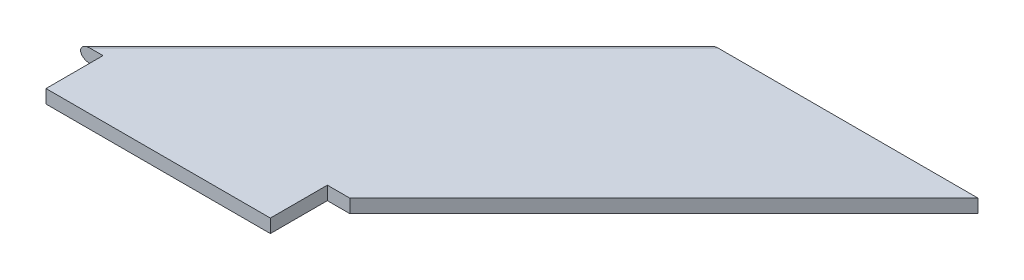
ISO-10303-21;
HEADER;
FILE_DESCRIPTION(('STEP AP214'),'2;1');
FILE_NAME('part.step','',(''),(''),'','','');
FILE_SCHEMA(('AUTOMOTIVE_DESIGN { 1 0 10303 214 1 1 1 1 }'));
ENDSEC;
DATA;
#1=APPLICATION_CONTEXT('core data for automotive mechanical design processes');
#2=APPLICATION_PROTOCOL_DEFINITION('international standard','automotive_design',2000,#1);
#3=PRODUCT_CONTEXT('',#1,'mechanical');
#4=PRODUCT('Part','Part','',(#3));
#5=PRODUCT_RELATED_PRODUCT_CATEGORY('part','',(#4));
#6=PRODUCT_DEFINITION_FORMATION('','',#4);
#7=PRODUCT_DEFINITION_CONTEXT('part definition',#1,'design');
#8=PRODUCT_DEFINITION('design','',#6,#7);
#9=PRODUCT_DEFINITION_SHAPE('','',#8);
#10=(LENGTH_UNIT() NAMED_UNIT(*) SI_UNIT(.MILLI.,.METRE.));
#11=(NAMED_UNIT(*) PLANE_ANGLE_UNIT() SI_UNIT($,.RADIAN.));
#12=(NAMED_UNIT(*) SI_UNIT($,.STERADIAN.) SOLID_ANGLE_UNIT());
#13=UNCERTAINTY_MEASURE_WITH_UNIT(LENGTH_MEASURE(1.E-05),#10,'distance_accuracy_value','');
#14=(GEOMETRIC_REPRESENTATION_CONTEXT(3) GLOBAL_UNCERTAINTY_ASSIGNED_CONTEXT((#13)) GLOBAL_UNIT_ASSIGNED_CONTEXT((#10,
#11,#12)) REPRESENTATION_CONTEXT('',''));
#15=CARTESIAN_POINT('',(0.,0.,0.));
#16=DIRECTION('',(0.,0.,1.));
#17=DIRECTION('',(1.,0.,0.));
#18=AXIS2_PLACEMENT_3D('',#15,#16,#17);
#19=CARTESIAN_POINT('',(4.99999999999999,3.,0.));
#20=DIRECTION('',(0.,0.,-1.));
#21=DIRECTION('',(-1.,0.,0.));
#22=AXIS2_PLACEMENT_3D('',#19,#20,#21);
#23=PLANE('',#22);
#24=DIRECTION('',(1.,0.,0.));
#25=VECTOR('',#24,1.);
#26=CARTESIAN_POINT('',(4.99999999999999,3.,0.));
#27=LINE('',#26,#25);
#28=CARTESIAN_POINT('',(2.12132034355964,3.,0.));
#29=VERTEX_POINT('',#28);
#30=CARTESIAN_POINT('',(4.99999999999999,3.,0.));
#31=VERTEX_POINT('',#30);
#32=EDGE_CURVE('E112',#29,#31,#27,.T.);
#33=ORIENTED_EDGE('',*,*,#32,.F.);
#34=CARTESIAN_POINT('',(2.12132034355964,1.5,0.));
#35=DIRECTION('',(0.,0.,-1.));
#36=DIRECTION('',(1.,0.,0.));
#37=AXIS2_PLACEMENT_3D('',#34,#35,#36);
#38=ELLIPSE('',#37,2.12132034355964,1.5);
#39=CARTESIAN_POINT('',(0.,1.5,0.));
#40=VERTEX_POINT('',#39);
#41=EDGE_CURVE('E149',#29,#40,#38,.F.);
#42=ORIENTED_EDGE('',*,*,#41,.T.);
#43=CARTESIAN_POINT('',(2.12132034355964,1.5,0.));
#44=DIRECTION('',(0.,0.,-1.));
#45=DIRECTION('',(-1.,0.,0.));
#46=AXIS2_PLACEMENT_3D('',#43,#44,#45);
#47=ELLIPSE('',#46,2.12132034355964,1.5);
#48=CARTESIAN_POINT('',(2.12132034355963,0.,0.));
#49=VERTEX_POINT('',#48);
#50=EDGE_CURVE('E141',#40,#49,#47,.F.);
#51=ORIENTED_EDGE('',*,*,#50,.T.);
#52=DIRECTION('',(1.,0.,0.));
#53=VECTOR('',#52,1.);
#54=CARTESIAN_POINT('',(4.99999999999999,0.,0.));
#55=LINE('',#54,#53);
#56=CARTESIAN_POINT('',(4.99999999999999,0.,0.));
#57=VERTEX_POINT('',#56);
#58=EDGE_CURVE('E135',#49,#57,#55,.T.);
#59=ORIENTED_EDGE('',*,*,#58,.T.);
#60=DIRECTION('',(0.,-1.,0.));
#61=VECTOR('',#60,1.);
#62=CARTESIAN_POINT('',(4.99999999999999,3.,0.));
#63=LINE('',#62,#61);
#64=EDGE_CURVE('E128',#31,#57,#63,.T.);
#65=ORIENTED_EDGE('',*,*,#64,.F.);
#66=EDGE_LOOP('',(#33,#42,#51,#59,#65));
#67=FACE_BOUND('',#66,.T.);
#68=ADVANCED_FACE('F39',(#67),#23,.F.);
#69=CARTESIAN_POINT('',(5.,3.,12.7));
#70=DIRECTION('',(1.,0.,0.));
#71=DIRECTION('',(0.,0.,-1.));
#72=AXIS2_PLACEMENT_3D('',#69,#70,#71);
#73=PLANE('',#72);
#74=DIRECTION('',(0.,0.,1.));
#75=VECTOR('',#74,1.);
#76=CARTESIAN_POINT('',(5.,0.,12.7));
#77=LINE('',#76,#75);
#78=CARTESIAN_POINT('',(5.,0.,12.7));
#79=VERTEX_POINT('',#78);
#80=EDGE_CURVE('E173',#57,#79,#77,.T.);
#81=ORIENTED_EDGE('',*,*,#80,.T.);
#82=DIRECTION('',(0.,-1.,0.));
#83=VECTOR('',#82,1.);
#84=CARTESIAN_POINT('',(5.,3.,12.7));
#85=LINE('',#84,#83);
#86=CARTESIAN_POINT('',(5.,3.,12.7));
#87=VERTEX_POINT('',#86);
#88=EDGE_CURVE('E130',#87,#79,#85,.T.);
#89=ORIENTED_EDGE('',*,*,#88,.F.);
#90=DIRECTION('',(0.,0.,1.));
#91=VECTOR('',#90,1.);
#92=CARTESIAN_POINT('',(5.,3.,12.7));
#93=LINE('',#92,#91);
#94=EDGE_CURVE('E116',#31,#87,#93,.T.);
#95=ORIENTED_EDGE('',*,*,#94,.F.);
#96=ORIENTED_EDGE('',*,*,#64,.T.);
#97=EDGE_LOOP('',(#81,#89,#95,#96));
#98=FACE_BOUND('',#97,.T.);
#99=ADVANCED_FACE('F127',(#98),#73,.F.);
#100=CARTESIAN_POINT('',(55.,3.,12.7));
#101=DIRECTION('',(0.,0.,-1.));
#102=DIRECTION('',(-1.,0.,0.));
#103=AXIS2_PLACEMENT_3D('',#100,#101,#102);
#104=PLANE('',#103);
#105=DIRECTION('',(1.,0.,0.));
#106=VECTOR('',#105,1.);
#107=CARTESIAN_POINT('',(55.,0.,12.7));
#108=LINE('',#107,#106);
#109=CARTESIAN_POINT('',(55.,0.,12.7));
#110=VERTEX_POINT('',#109);
#111=EDGE_CURVE('E176',#79,#110,#108,.T.);
#112=ORIENTED_EDGE('',*,*,#111,.T.);
#113=DIRECTION('',(0.,-1.,0.));
#114=VECTOR('',#113,1.);
#115=CARTESIAN_POINT('',(55.,3.,12.7));
#116=LINE('',#115,#114);
#117=CARTESIAN_POINT('',(55.,3.,12.7));
#118=VERTEX_POINT('',#117);
#119=EDGE_CURVE('E143',#118,#110,#116,.T.);
#120=ORIENTED_EDGE('',*,*,#119,.F.);
#121=DIRECTION('',(1.,0.,0.));
#122=VECTOR('',#121,1.);
#123=CARTESIAN_POINT('',(55.,3.,12.7));
#124=LINE('',#123,#122);
#125=EDGE_CURVE('E133',#87,#118,#124,.T.);
#126=ORIENTED_EDGE('',*,*,#125,.F.);
#127=ORIENTED_EDGE('',*,*,#88,.T.);
#128=EDGE_LOOP('',(#112,#120,#126,#127));
#129=FACE_BOUND('',#128,.T.);
#130=ADVANCED_FACE('F230',(#129),#104,.F.);
#131=CARTESIAN_POINT('',(55.,3.,0.));
#132=DIRECTION('',(-1.,0.,0.));
#133=DIRECTION('',(0.,0.,1.));
#134=AXIS2_PLACEMENT_3D('',#131,#132,#133);
#135=PLANE('',#134);
#136=DIRECTION('',(0.,0.,-1.));
#137=VECTOR('',#136,1.);
#138=CARTESIAN_POINT('',(55.,0.,0.));
#139=LINE('',#138,#137);
#140=CARTESIAN_POINT('',(55.,0.,0.));
#141=VERTEX_POINT('',#140);
#142=EDGE_CURVE('E182',#110,#141,#139,.T.);
#143=ORIENTED_EDGE('',*,*,#142,.T.);
#144=DIRECTION('',(0.,-1.,0.));
#145=VECTOR('',#144,1.);
#146=CARTESIAN_POINT('',(55.,3.,0.));
#147=LINE('',#146,#145);
#148=CARTESIAN_POINT('',(55.,3.,0.));
#149=VERTEX_POINT('',#148);
#150=EDGE_CURVE('E199',#149,#141,#147,.T.);
#151=ORIENTED_EDGE('',*,*,#150,.F.);
#152=DIRECTION('',(0.,0.,-1.));
#153=VECTOR('',#152,1.);
#154=CARTESIAN_POINT('',(55.,3.,0.));
#155=LINE('',#154,#153);
#156=EDGE_CURVE('E210',#118,#149,#155,.T.);
#157=ORIENTED_EDGE('',*,*,#156,.F.);
#158=ORIENTED_EDGE('',*,*,#119,.T.);
#159=EDGE_LOOP('',(#143,#151,#157,#158));
#160=FACE_BOUND('',#159,.T.);
#161=ADVANCED_FACE('F208',(#160),#135,.F.);
#162=CARTESIAN_POINT('',(60.,3.,0.));
#163=DIRECTION('',(0.,0.,-1.));
#164=DIRECTION('',(-1.,0.,0.));
#165=AXIS2_PLACEMENT_3D('',#162,#163,#164);
#166=PLANE('',#165);
#167=DIRECTION('',(1.,0.,0.));
#168=VECTOR('',#167,1.);
#169=CARTESIAN_POINT('',(60.,0.,0.));
#170=LINE('',#169,#168);
#171=CARTESIAN_POINT('',(60.,0.,0.));
#172=VERTEX_POINT('',#171);
#173=EDGE_CURVE('E185',#141,#172,#170,.T.);
#174=ORIENTED_EDGE('',*,*,#173,.T.);
#175=DIRECTION('',(0.,-1.,0.));
#176=VECTOR('',#175,1.);
#177=CARTESIAN_POINT('',(60.,3.,0.));
#178=LINE('',#177,#176);
#179=CARTESIAN_POINT('',(60.,3.,0.));
#180=VERTEX_POINT('',#179);
#181=EDGE_CURVE('E195',#180,#172,#178,.T.);
#182=ORIENTED_EDGE('',*,*,#181,.F.);
#183=DIRECTION('',(1.,0.,0.));
#184=VECTOR('',#183,1.);
#185=CARTESIAN_POINT('',(60.,3.,0.));
#186=LINE('',#185,#184);
#187=EDGE_CURVE('E223',#149,#180,#186,.T.);
#188=ORIENTED_EDGE('',*,*,#187,.F.);
#189=ORIENTED_EDGE('',*,*,#150,.T.);
#190=EDGE_LOOP('',(#174,#182,#188,#189));
#191=FACE_BOUND('',#190,.T.);
#192=ADVANCED_FACE('F218',(#191),#166,.F.);
#193=CARTESIAN_POINT('',(130.,3.,-70.));
#194=DIRECTION('',(-0.707106781186548,0.,-0.707106781186547));
#195=DIRECTION('',(-0.707106781186547,0.,0.707106781186548));
#196=AXIS2_PLACEMENT_3D('',#193,#194,#195);
#197=PLANE('',#196);
#198=DIRECTION('',(0.707106781186547,0.,-0.707106781186548));
#199=VECTOR('',#198,1.);
#200=CARTESIAN_POINT('',(130.,0.,-70.));
#201=LINE('',#200,#199);
#202=CARTESIAN_POINT('',(130.,0.,-70.));
#203=VERTEX_POINT('',#202);
#204=EDGE_CURVE('E188',#172,#203,#201,.T.);
#205=ORIENTED_EDGE('',*,*,#204,.T.);
#206=DIRECTION('',(0.,-1.,0.));
#207=VECTOR('',#206,1.);
#208=CARTESIAN_POINT('',(130.,3.,-70.));
#209=LINE('',#208,#207);
#210=CARTESIAN_POINT('',(130.,3.,-70.));
#211=VERTEX_POINT('',#210);
#212=EDGE_CURVE('E166',#211,#203,#209,.T.);
#213=ORIENTED_EDGE('',*,*,#212,.F.);
#214=DIRECTION('',(0.707106781186547,0.,-0.707106781186548));
#215=VECTOR('',#214,1.);
#216=CARTESIAN_POINT('',(130.,3.,-70.));
#217=LINE('',#216,#215);
#218=EDGE_CURVE('E163',#180,#211,#217,.T.);
#219=ORIENTED_EDGE('',*,*,#218,.F.);
#220=ORIENTED_EDGE('',*,*,#181,.T.);
#221=EDGE_LOOP('',(#205,#213,#219,#220));
#222=FACE_BOUND('',#221,.T.);
#223=ADVANCED_FACE('F221',(#222),#197,.F.);
#224=CARTESIAN_POINT('',(70.,3.,-70.));
#225=DIRECTION('',(0.,0.,1.));
#226=DIRECTION('',(1.,0.,0.));
#227=AXIS2_PLACEMENT_3D('',#224,#225,#226);
#228=PLANE('',#227);
#229=CARTESIAN_POINT('',(72.1213203435596,1.5,-70.));
#230=DIRECTION('',(0.,0.,1.));
#231=DIRECTION('',(-1.,0.,0.));
#232=AXIS2_PLACEMENT_3D('',#229,#230,#231);
#233=ELLIPSE('',#232,2.12132034355964,1.5);
#234=CARTESIAN_POINT('',(72.1213203435596,0.,-70.));
#235=VERTEX_POINT('',#234);
#236=CARTESIAN_POINT('',(70.,1.5,-70.));
#237=VERTEX_POINT('',#236);
#238=EDGE_CURVE('E56',#235,#237,#233,.F.);
#239=ORIENTED_EDGE('',*,*,#238,.T.);
#240=CARTESIAN_POINT('',(72.1213203435596,1.5,-70.));
#241=DIRECTION('',(0.,0.,1.));
#242=DIRECTION('',(1.,0.,0.));
#243=AXIS2_PLACEMENT_3D('',#240,#241,#242);
#244=ELLIPSE('',#243,2.12132034355964,1.5);
#245=CARTESIAN_POINT('',(72.1213203435596,3.,-70.));
#246=VERTEX_POINT('',#245);
#247=EDGE_CURVE('E49',#237,#246,#244,.F.);
#248=ORIENTED_EDGE('',*,*,#247,.T.);
#249=DIRECTION('',(-1.,0.,0.));
#250=VECTOR('',#249,1.);
#251=CARTESIAN_POINT('',(70.,3.,-70.));
#252=LINE('',#251,#250);
#253=EDGE_CURVE('E159',#211,#246,#252,.T.);
#254=ORIENTED_EDGE('',*,*,#253,.F.);
#255=ORIENTED_EDGE('',*,*,#212,.T.);
#256=DIRECTION('',(-1.,0.,0.));
#257=VECTOR('',#256,1.);
#258=CARTESIAN_POINT('',(70.,0.,-70.));
#259=LINE('',#258,#257);
#260=EDGE_CURVE('E123',#203,#235,#259,.T.);
#261=ORIENTED_EDGE('',*,*,#260,.T.);
#262=EDGE_LOOP('',(#239,#248,#254,#255,#261));
#263=FACE_BOUND('',#262,.T.);
#264=ADVANCED_FACE('F157',(#263),#228,.F.);
#265=CARTESIAN_POINT('',(0.,3.,0.));
#266=DIRECTION('',(0.,1.,0.));
#267=DIRECTION('',(0.,0.,1.));
#268=AXIS2_PLACEMENT_3D('',#265,#266,#267);
#269=PLANE('',#268);
#270=ORIENTED_EDGE('',*,*,#253,.T.);
#271=DIRECTION('',(-0.707106781186547,0.,0.707106781186548));
#272=VECTOR('',#271,1.);
#273=CARTESIAN_POINT('',(1.06066017177982,3.,1.06066017177982));
#274=LINE('',#273,#272);
#275=EDGE_CURVE('E119',#246,#29,#274,.T.);
#276=ORIENTED_EDGE('',*,*,#275,.T.);
#277=ORIENTED_EDGE('',*,*,#32,.T.);
#278=ORIENTED_EDGE('',*,*,#94,.T.);
#279=ORIENTED_EDGE('',*,*,#125,.T.);
#280=ORIENTED_EDGE('',*,*,#156,.T.);
#281=ORIENTED_EDGE('',*,*,#187,.T.);
#282=ORIENTED_EDGE('',*,*,#218,.T.);
#283=EDGE_LOOP('',(#270,#276,#277,#278,#279,#280,#281,#282));
#284=FACE_BOUND('',#283,.T.);
#285=ADVANCED_FACE('F115',(#284),#269,.T.);
#286=CARTESIAN_POINT('',(0.,0.,0.));
#287=DIRECTION('',(0.,1.,0.));
#288=DIRECTION('',(0.,0.,1.));
#289=AXIS2_PLACEMENT_3D('',#286,#287,#288);
#290=PLANE('',#289);
#291=ORIENTED_EDGE('',*,*,#58,.F.);
#292=DIRECTION('',(-0.707106781186547,0.,0.707106781186548));
#293=VECTOR('',#292,1.);
#294=CARTESIAN_POINT('',(1.06066017177982,0.,1.06066017177982));
#295=LINE('',#294,#293);
#296=EDGE_CURVE('E11',#49,#235,#295,.F.);
#297=ORIENTED_EDGE('',*,*,#296,.T.);
#298=ORIENTED_EDGE('',*,*,#260,.F.);
#299=ORIENTED_EDGE('',*,*,#204,.F.);
#300=ORIENTED_EDGE('',*,*,#173,.F.);
#301=ORIENTED_EDGE('',*,*,#142,.F.);
#302=ORIENTED_EDGE('',*,*,#111,.F.);
#303=ORIENTED_EDGE('',*,*,#80,.F.);
#304=EDGE_LOOP('',(#291,#297,#298,#299,#300,#301,#302,#303));
#305=FACE_BOUND('',#304,.T.);
#306=ADVANCED_FACE('F214',(#305),#290,.F.);
#307=CARTESIAN_POINT('',(1.06066017177982,1.5,1.06066017177982));
#308=DIRECTION('',(-0.707106781186547,0.,0.707106781186548));
#309=DIRECTION('',(0.707106781186548,0.,0.707106781186547));
#310=AXIS2_PLACEMENT_3D('',#307,#308,#309);
#311=CYLINDRICAL_SURFACE('',#310,1.5);
#312=DIRECTION('',(-0.707106781186547,0.,0.707106781186548));
#313=VECTOR('',#312,1.);
#314=CARTESIAN_POINT('',(0.,1.5,0.));
#315=LINE('',#314,#313);
#316=EDGE_CURVE('E43',#237,#40,#315,.T.);
#317=ORIENTED_EDGE('',*,*,#316,.F.);
#318=ORIENTED_EDGE('',*,*,#238,.F.);
#319=ORIENTED_EDGE('',*,*,#296,.F.);
#320=ORIENTED_EDGE('',*,*,#50,.F.);
#321=EDGE_LOOP('',(#317,#318,#319,#320));
#322=FACE_BOUND('',#321,.T.);
#323=ADVANCED_FACE('F41',(#322),#311,.T.);
#324=CARTESIAN_POINT('',(1.06066017177982,1.5,1.06066017177982));
#325=DIRECTION('',(0.707106781186547,0.,-0.707106781186548));
#326=DIRECTION('',(-0.707106781186548,0.,-0.707106781186547));
#327=AXIS2_PLACEMENT_3D('',#324,#325,#326);
#328=CYLINDRICAL_SURFACE('',#327,1.5);
#329=ORIENTED_EDGE('',*,*,#247,.F.);
#330=ORIENTED_EDGE('',*,*,#316,.T.);
#331=ORIENTED_EDGE('',*,*,#41,.F.);
#332=ORIENTED_EDGE('',*,*,#275,.F.);
#333=EDGE_LOOP('',(#329,#330,#331,#332));
#334=FACE_BOUND('',#333,.T.);
#335=ADVANCED_FACE('F168',(#334),#328,.T.);
#336=CLOSED_SHELL('',(#68,#99,#130,#161,#192,#223,#264,#285,#306,#323,#335));
#337=MANIFOLD_SOLID_BREP('B2',#336);
#338=ADVANCED_BREP_SHAPE_REPRESENTATION('',(#18,#337),#14);
#339=SHAPE_DEFINITION_REPRESENTATION(#9,#338);
ENDSEC;
END-ISO-10303-21;
